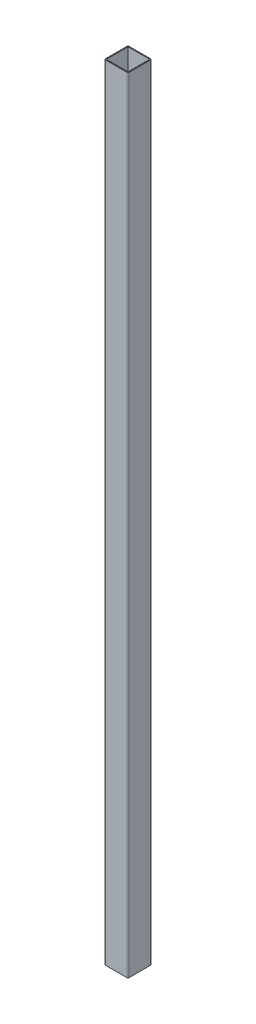
ISO-10303-21;
HEADER;
FILE_DESCRIPTION(('STEP AP214'),'2;1');
FILE_NAME('part.step','',(''),(''),'','','');
FILE_SCHEMA(('AUTOMOTIVE_DESIGN { 1 0 10303 214 1 1 1 1 }'));
ENDSEC;
DATA;
#1=APPLICATION_CONTEXT('core data for automotive mechanical design processes');
#2=APPLICATION_PROTOCOL_DEFINITION('international standard','automotive_design',2000,#1);
#3=PRODUCT_CONTEXT('',#1,'mechanical');
#4=PRODUCT('Part','Part','',(#3));
#5=PRODUCT_RELATED_PRODUCT_CATEGORY('part','',(#4));
#6=PRODUCT_DEFINITION_FORMATION('','',#4);
#7=PRODUCT_DEFINITION_CONTEXT('part definition',#1,'design');
#8=PRODUCT_DEFINITION('design','',#6,#7);
#9=PRODUCT_DEFINITION_SHAPE('','',#8);
#10=(LENGTH_UNIT() NAMED_UNIT(*) SI_UNIT(.MILLI.,.METRE.));
#11=(NAMED_UNIT(*) PLANE_ANGLE_UNIT() SI_UNIT($,.RADIAN.));
#12=(NAMED_UNIT(*) SI_UNIT($,.STERADIAN.) SOLID_ANGLE_UNIT());
#13=UNCERTAINTY_MEASURE_WITH_UNIT(LENGTH_MEASURE(1.E-05),#10,'distance_accuracy_value','');
#14=(GEOMETRIC_REPRESENTATION_CONTEXT(3) GLOBAL_UNCERTAINTY_ASSIGNED_CONTEXT((#13)) GLOBAL_UNIT_ASSIGNED_CONTEXT((#10,
#11,#12)) REPRESENTATION_CONTEXT('',''));
#15=CARTESIAN_POINT('',(0.,0.,0.));
#16=DIRECTION('',(0.,0.,1.));
#17=DIRECTION('',(1.,0.,0.));
#18=AXIS2_PLACEMENT_3D('',#15,#16,#17);
#19=CARTESIAN_POINT('',(73.9990000000007,-5328.,73.999));
#20=DIRECTION('',(0.,1.,0.));
#21=DIRECTION('',(-1.,0.,0.));
#22=AXIS2_PLACEMENT_3D('',#19,#20,#21);
#23=CYLINDRICAL_SURFACE('',#22,6.00100000000001);
#24=CARTESIAN_POINT('',(73.999,0.,73.999));
#25=DIRECTION('',(0.,-1.,0.));
#26=DIRECTION('',(1.,0.,0.));
#27=AXIS2_PLACEMENT_3D('',#24,#25,#26);
#28=CIRCLE('',#27,6.00100000000001);
#29=CARTESIAN_POINT('',(80.,0.,73.999));
#30=VERTEX_POINT('',#29);
#31=CARTESIAN_POINT('',(73.999,0.,80.));
#32=VERTEX_POINT('',#31);
#33=EDGE_CURVE('E236',#30,#32,#28,.T.);
#34=ORIENTED_EDGE('',*,*,#33,.T.);
#35=DIRECTION('',(0.,1.,0.));
#36=VECTOR('',#35,1.);
#37=CARTESIAN_POINT('',(73.9990000000007,-5328.,80.));
#38=LINE('',#37,#36);
#39=CARTESIAN_POINT('',(73.9990000000007,-5328.,80.));
#40=VERTEX_POINT('',#39);
#41=EDGE_CURVE('E12',#40,#32,#38,.T.);
#42=ORIENTED_EDGE('',*,*,#41,.F.);
#43=CARTESIAN_POINT('',(73.9990000000007,-5328.,73.999));
#44=DIRECTION('',(0.,-1.,0.));
#45=DIRECTION('',(1.,0.,0.));
#46=AXIS2_PLACEMENT_3D('',#43,#44,#45);
#47=CIRCLE('',#46,6.00100000000001);
#48=CARTESIAN_POINT('',(80.0000000000006,-5328.,73.999));
#49=VERTEX_POINT('',#48);
#50=EDGE_CURVE('E314',#49,#40,#47,.T.);
#51=ORIENTED_EDGE('',*,*,#50,.F.);
#52=DIRECTION('',(0.,1.,0.));
#53=VECTOR('',#52,1.);
#54=CARTESIAN_POINT('',(80.0000000000006,-5328.,73.999));
#55=LINE('',#54,#53);
#56=EDGE_CURVE('E251',#49,#30,#55,.T.);
#57=ORIENTED_EDGE('',*,*,#56,.T.);
#58=EDGE_LOOP('',(#34,#42,#51,#57));
#59=FACE_BOUND('',#58,.T.);
#60=ADVANCED_FACE('F64',(#59),#23,.T.);
#61=CARTESIAN_POINT('',(73.9990000000007,-5328.,80.));
#62=DIRECTION('',(0.,0.,-1.));
#63=DIRECTION('',(-1.,0.,0.));
#64=AXIS2_PLACEMENT_3D('',#61,#62,#63);
#65=PLANE('',#64);
#66=DIRECTION('',(-1.,0.,0.));
#67=VECTOR('',#66,1.);
#68=CARTESIAN_POINT('',(73.999,0.,80.));
#69=LINE('',#68,#67);
#70=CARTESIAN_POINT('',(-73.999,0.,80.));
#71=VERTEX_POINT('',#70);
#72=EDGE_CURVE('E239',#32,#71,#69,.T.);
#73=ORIENTED_EDGE('',*,*,#72,.T.);
#74=DIRECTION('',(0.,1.,0.));
#75=VECTOR('',#74,1.);
#76=CARTESIAN_POINT('',(-73.9989999999994,-5328.,80.));
#77=LINE('',#76,#75);
#78=CARTESIAN_POINT('',(-73.9989999999994,-5328.,80.));
#79=VERTEX_POINT('',#78);
#80=EDGE_CURVE('E74',#79,#71,#77,.T.);
#81=ORIENTED_EDGE('',*,*,#80,.F.);
#82=DIRECTION('',(-1.,0.,0.));
#83=VECTOR('',#82,1.);
#84=CARTESIAN_POINT('',(73.9990000000007,-5328.,80.));
#85=LINE('',#84,#83);
#86=EDGE_CURVE('E316',#40,#79,#85,.T.);
#87=ORIENTED_EDGE('',*,*,#86,.F.);
#88=ORIENTED_EDGE('',*,*,#41,.T.);
#89=EDGE_LOOP('',(#73,#81,#87,#88));
#90=FACE_BOUND('',#89,.T.);
#91=ADVANCED_FACE('F351',(#90),#65,.F.);
#92=CARTESIAN_POINT('',(-73.9989999999994,-5328.,73.999));
#93=DIRECTION('',(0.,1.,0.));
#94=DIRECTION('',(-1.,0.,0.));
#95=AXIS2_PLACEMENT_3D('',#92,#93,#94);
#96=CYLINDRICAL_SURFACE('',#95,6.00100000000001);
#97=CARTESIAN_POINT('',(-73.999,0.,73.999));
#98=DIRECTION('',(0.,-1.,0.));
#99=DIRECTION('',(1.,0.,0.));
#100=AXIS2_PLACEMENT_3D('',#97,#98,#99);
#101=CIRCLE('',#100,6.00100000000001);
#102=CARTESIAN_POINT('',(-80.,0.,73.999));
#103=VERTEX_POINT('',#102);
#104=EDGE_CURVE('E241',#71,#103,#101,.T.);
#105=ORIENTED_EDGE('',*,*,#104,.T.);
#106=DIRECTION('',(0.,1.,0.));
#107=VECTOR('',#106,1.);
#108=CARTESIAN_POINT('',(-79.9999999999993,-5328.,73.999));
#109=LINE('',#108,#107);
#110=CARTESIAN_POINT('',(-79.9999999999993,-5328.,73.999));
#111=VERTEX_POINT('',#110);
#112=EDGE_CURVE('E258',#111,#103,#109,.T.);
#113=ORIENTED_EDGE('',*,*,#112,.F.);
#114=CARTESIAN_POINT('',(-73.9989999999994,-5328.,73.999));
#115=DIRECTION('',(0.,-1.,0.));
#116=DIRECTION('',(1.,0.,0.));
#117=AXIS2_PLACEMENT_3D('',#114,#115,#116);
#118=CIRCLE('',#117,6.00100000000001);
#119=EDGE_CURVE('E318',#79,#111,#118,.T.);
#120=ORIENTED_EDGE('',*,*,#119,.F.);
#121=ORIENTED_EDGE('',*,*,#80,.T.);
#122=EDGE_LOOP('',(#105,#113,#120,#121));
#123=FACE_BOUND('',#122,.T.);
#124=ADVANCED_FACE('F356',(#123),#96,.T.);
#125=CARTESIAN_POINT('',(-79.9999999999993,-5328.,-73.999));
#126=DIRECTION('',(1.,0.,0.));
#127=DIRECTION('',(0.,1.,0.));
#128=AXIS2_PLACEMENT_3D('',#125,#126,#127);
#129=PLANE('',#128);
#130=DIRECTION('',(0.,0.,-1.));
#131=VECTOR('',#130,1.);
#132=CARTESIAN_POINT('',(-80.,0.,-73.999));
#133=LINE('',#132,#131);
#134=CARTESIAN_POINT('',(-80.,0.,-73.999));
#135=VERTEX_POINT('',#134);
#136=EDGE_CURVE('E243',#103,#135,#133,.T.);
#137=ORIENTED_EDGE('',*,*,#136,.T.);
#138=DIRECTION('',(0.,1.,0.));
#139=VECTOR('',#138,1.);
#140=CARTESIAN_POINT('',(-79.9999999999993,-5328.,-73.999));
#141=LINE('',#140,#139);
#142=CARTESIAN_POINT('',(-79.9999999999993,-5328.,-73.999));
#143=VERTEX_POINT('',#142);
#144=EDGE_CURVE('E255',#143,#135,#141,.T.);
#145=ORIENTED_EDGE('',*,*,#144,.F.);
#146=DIRECTION('',(0.,0.,-1.));
#147=VECTOR('',#146,1.);
#148=CARTESIAN_POINT('',(-79.9999999999993,-5328.,-73.999));
#149=LINE('',#148,#147);
#150=EDGE_CURVE('E320',#111,#143,#149,.T.);
#151=ORIENTED_EDGE('',*,*,#150,.F.);
#152=ORIENTED_EDGE('',*,*,#112,.T.);
#153=EDGE_LOOP('',(#137,#145,#151,#152));
#154=FACE_BOUND('',#153,.T.);
#155=ADVANCED_FACE('F326',(#154),#129,.F.);
#156=CARTESIAN_POINT('',(-73.9989999999993,-5328.,-73.999));
#157=DIRECTION('',(0.,1.,0.));
#158=DIRECTION('',(-1.,0.,0.));
#159=AXIS2_PLACEMENT_3D('',#156,#157,#158);
#160=CYLINDRICAL_SURFACE('',#159,6.001);
#161=CARTESIAN_POINT('',(-73.999,0.,-73.999));
#162=DIRECTION('',(0.,-1.,0.));
#163=DIRECTION('',(1.,0.,0.));
#164=AXIS2_PLACEMENT_3D('',#161,#162,#163);
#165=CIRCLE('',#164,6.001);
#166=CARTESIAN_POINT('',(-73.999,0.,-80.));
#167=VERTEX_POINT('',#166);
#168=EDGE_CURVE('E245',#135,#167,#165,.T.);
#169=ORIENTED_EDGE('',*,*,#168,.T.);
#170=DIRECTION('',(0.,1.,0.));
#171=VECTOR('',#170,1.);
#172=CARTESIAN_POINT('',(-73.9989999999994,-5328.,-80.));
#173=LINE('',#172,#171);
#174=CARTESIAN_POINT('',(-73.9989999999994,-5328.,-80.));
#175=VERTEX_POINT('',#174);
#176=EDGE_CURVE('E203',#175,#167,#173,.T.);
#177=ORIENTED_EDGE('',*,*,#176,.F.);
#178=CARTESIAN_POINT('',(-73.9989999999993,-5328.,-73.999));
#179=DIRECTION('',(0.,-1.,0.));
#180=DIRECTION('',(1.,0.,0.));
#181=AXIS2_PLACEMENT_3D('',#178,#179,#180);
#182=CIRCLE('',#181,6.001);
#183=EDGE_CURVE('E194',#143,#175,#182,.T.);
#184=ORIENTED_EDGE('',*,*,#183,.F.);
#185=ORIENTED_EDGE('',*,*,#144,.T.);
#186=EDGE_LOOP('',(#169,#177,#184,#185));
#187=FACE_BOUND('',#186,.T.);
#188=ADVANCED_FACE('F330',(#187),#160,.T.);
#189=CARTESIAN_POINT('',(-73.9989999999994,-5328.,-80.));
#190=DIRECTION('',(0.,0.,1.));
#191=DIRECTION('',(1.,0.,0.));
#192=AXIS2_PLACEMENT_3D('',#189,#190,#191);
#193=PLANE('',#192);
#194=DIRECTION('',(1.,0.,0.));
#195=VECTOR('',#194,1.);
#196=CARTESIAN_POINT('',(-73.999,0.,-80.));
#197=LINE('',#196,#195);
#198=CARTESIAN_POINT('',(73.999,0.,-80.));
#199=VERTEX_POINT('',#198);
#200=EDGE_CURVE('E202',#167,#199,#197,.T.);
#201=ORIENTED_EDGE('',*,*,#200,.T.);
#202=DIRECTION('',(0.,1.,0.));
#203=VECTOR('',#202,1.);
#204=CARTESIAN_POINT('',(73.9990000000007,-5328.,-80.));
#205=LINE('',#204,#203);
#206=CARTESIAN_POINT('',(73.9990000000007,-5328.,-80.));
#207=VERTEX_POINT('',#206);
#208=EDGE_CURVE('E199',#207,#199,#205,.T.);
#209=ORIENTED_EDGE('',*,*,#208,.F.);
#210=DIRECTION('',(1.,0.,0.));
#211=VECTOR('',#210,1.);
#212=CARTESIAN_POINT('',(-73.9989999999994,-5328.,-80.));
#213=LINE('',#212,#211);
#214=EDGE_CURVE('E188',#175,#207,#213,.T.);
#215=ORIENTED_EDGE('',*,*,#214,.F.);
#216=ORIENTED_EDGE('',*,*,#176,.T.);
#217=EDGE_LOOP('',(#201,#209,#215,#216));
#218=FACE_BOUND('',#217,.T.);
#219=ADVANCED_FACE('F200',(#218),#193,.F.);
#220=CARTESIAN_POINT('',(73.9990000000006,-5328.,-73.999));
#221=DIRECTION('',(0.,1.,0.));
#222=DIRECTION('',(-1.,0.,0.));
#223=AXIS2_PLACEMENT_3D('',#220,#221,#222);
#224=CYLINDRICAL_SURFACE('',#223,6.001);
#225=CARTESIAN_POINT('',(73.999,0.,-73.999));
#226=DIRECTION('',(0.,-1.,0.));
#227=DIRECTION('',(1.,0.,0.));
#228=AXIS2_PLACEMENT_3D('',#225,#226,#227);
#229=CIRCLE('',#228,6.001);
#230=CARTESIAN_POINT('',(80.,0.,-73.999));
#231=VERTEX_POINT('',#230);
#232=EDGE_CURVE('E136',#199,#231,#229,.T.);
#233=ORIENTED_EDGE('',*,*,#232,.T.);
#234=DIRECTION('',(0.,1.,0.));
#235=VECTOR('',#234,1.);
#236=CARTESIAN_POINT('',(80.0000000000006,-5328.,-73.999));
#237=LINE('',#236,#235);
#238=CARTESIAN_POINT('',(80.0000000000006,-5328.,-73.999));
#239=VERTEX_POINT('',#238);
#240=EDGE_CURVE('E204',#239,#231,#237,.T.);
#241=ORIENTED_EDGE('',*,*,#240,.F.);
#242=CARTESIAN_POINT('',(73.9990000000006,-5328.,-73.999));
#243=DIRECTION('',(0.,-1.,0.));
#244=DIRECTION('',(1.,0.,0.));
#245=AXIS2_PLACEMENT_3D('',#242,#243,#244);
#246=CIRCLE('',#245,6.001);
#247=EDGE_CURVE('E192',#207,#239,#246,.T.);
#248=ORIENTED_EDGE('',*,*,#247,.F.);
#249=ORIENTED_EDGE('',*,*,#208,.T.);
#250=EDGE_LOOP('',(#233,#241,#248,#249));
#251=FACE_BOUND('',#250,.T.);
#252=ADVANCED_FACE('F206',(#251),#224,.T.);
#253=CARTESIAN_POINT('',(-73.9989999999994,-5328.,73.999));
#254=DIRECTION('',(0.,1.,0.));
#255=DIRECTION('',(-1.,0.,0.));
#256=AXIS2_PLACEMENT_3D('',#253,#254,#255);
#257=CYLINDRICAL_SURFACE('',#256,0.000999999999987122);
#258=CARTESIAN_POINT('',(-73.999,0.,73.999));
#259=DIRECTION('',(0.,-1.,0.));
#260=DIRECTION('',(1.,0.,0.));
#261=AXIS2_PLACEMENT_3D('',#258,#259,#260);
#262=CIRCLE('',#261,0.000999999999987122);
#263=CARTESIAN_POINT('',(-73.999,0.,74.));
#264=VERTEX_POINT('',#263);
#265=CARTESIAN_POINT('',(-74.,0.,73.999));
#266=VERTEX_POINT('',#265);
#267=EDGE_CURVE('E212',#264,#266,#262,.T.);
#268=ORIENTED_EDGE('',*,*,#267,.F.);
#269=DIRECTION('',(0.,1.,0.));
#270=VECTOR('',#269,1.);
#271=CARTESIAN_POINT('',(-73.9989999999993,-5328.,74.));
#272=LINE('',#271,#270);
#273=CARTESIAN_POINT('',(-73.9989999999993,-5328.,74.));
#274=VERTEX_POINT('',#273);
#275=EDGE_CURVE('E68',#274,#264,#272,.T.);
#276=ORIENTED_EDGE('',*,*,#275,.F.);
#277=CARTESIAN_POINT('',(-73.9989999999994,-5328.,73.999));
#278=DIRECTION('',(0.,-1.,0.));
#279=DIRECTION('',(1.,0.,0.));
#280=AXIS2_PLACEMENT_3D('',#277,#278,#279);
#281=CIRCLE('',#280,0.000999999999987122);
#282=CARTESIAN_POINT('',(-73.9999999999993,-5328.,73.999));
#283=VERTEX_POINT('',#282);
#284=EDGE_CURVE('E250',#274,#283,#281,.T.);
#285=ORIENTED_EDGE('',*,*,#284,.T.);
#286=DIRECTION('',(0.,1.,0.));
#287=VECTOR('',#286,1.);
#288=CARTESIAN_POINT('',(-73.9999999999993,-5328.,73.999));
#289=LINE('',#288,#287);
#290=EDGE_CURVE('E208',#283,#266,#289,.T.);
#291=ORIENTED_EDGE('',*,*,#290,.T.);
#292=EDGE_LOOP('',(#268,#276,#285,#291));
#293=FACE_BOUND('',#292,.T.);
#294=ADVANCED_FACE('F66',(#293),#257,.F.);
#295=CARTESIAN_POINT('',(73.9990000000006,-5328.,74.));
#296=DIRECTION('',(0.,0.,-1.));
#297=DIRECTION('',(-1.,0.,0.));
#298=AXIS2_PLACEMENT_3D('',#295,#296,#297);
#299=PLANE('',#298);
#300=DIRECTION('',(-1.,0.,0.));
#301=VECTOR('',#300,1.);
#302=CARTESIAN_POINT('',(73.999,0.,74.));
#303=LINE('',#302,#301);
#304=CARTESIAN_POINT('',(73.999,0.,74.));
#305=VERTEX_POINT('',#304);
#306=EDGE_CURVE('E215',#305,#264,#303,.T.);
#307=ORIENTED_EDGE('',*,*,#306,.F.);
#308=DIRECTION('',(0.,1.,0.));
#309=VECTOR('',#308,1.);
#310=CARTESIAN_POINT('',(73.9990000000006,-5328.,74.));
#311=LINE('',#310,#309);
#312=CARTESIAN_POINT('',(73.9990000000006,-5328.,74.));
#313=VERTEX_POINT('',#312);
#314=EDGE_CURVE('E273',#313,#305,#311,.T.);
#315=ORIENTED_EDGE('',*,*,#314,.F.);
#316=DIRECTION('',(-1.,0.,0.));
#317=VECTOR('',#316,1.);
#318=CARTESIAN_POINT('',(73.9990000000006,-5328.,74.));
#319=LINE('',#318,#317);
#320=EDGE_CURVE('E282',#313,#274,#319,.T.);
#321=ORIENTED_EDGE('',*,*,#320,.T.);
#322=ORIENTED_EDGE('',*,*,#275,.T.);
#323=EDGE_LOOP('',(#307,#315,#321,#322));
#324=FACE_BOUND('',#323,.T.);
#325=ADVANCED_FACE('F280',(#324),#299,.T.);
#326=CARTESIAN_POINT('',(73.9990000000007,-5328.,73.999));
#327=DIRECTION('',(0.,1.,0.));
#328=DIRECTION('',(-1.,0.,0.));
#329=AXIS2_PLACEMENT_3D('',#326,#327,#328);
#330=CYLINDRICAL_SURFACE('',#329,0.000999999999987122);
#331=CARTESIAN_POINT('',(73.999,0.,73.999));
#332=DIRECTION('',(0.,-1.,0.));
#333=DIRECTION('',(1.,0.,0.));
#334=AXIS2_PLACEMENT_3D('',#331,#332,#333);
#335=CIRCLE('',#334,0.000999999999987122);
#336=CARTESIAN_POINT('',(74.,0.,73.999));
#337=VERTEX_POINT('',#336);
#338=EDGE_CURVE('E218',#337,#305,#335,.T.);
#339=ORIENTED_EDGE('',*,*,#338,.F.);
#340=DIRECTION('',(0.,1.,0.));
#341=VECTOR('',#340,1.);
#342=CARTESIAN_POINT('',(74.0000000000007,-5328.,73.999));
#343=LINE('',#342,#341);
#344=CARTESIAN_POINT('',(74.0000000000007,-5328.,73.999));
#345=VERTEX_POINT('',#344);
#346=EDGE_CURVE('E272',#345,#337,#343,.T.);
#347=ORIENTED_EDGE('',*,*,#346,.F.);
#348=CARTESIAN_POINT('',(73.9990000000007,-5328.,73.999));
#349=DIRECTION('',(0.,-1.,0.));
#350=DIRECTION('',(1.,0.,0.));
#351=AXIS2_PLACEMENT_3D('',#348,#349,#350);
#352=CIRCLE('',#351,0.000999999999987122);
#353=EDGE_CURVE('E290',#345,#313,#352,.T.);
#354=ORIENTED_EDGE('',*,*,#353,.T.);
#355=ORIENTED_EDGE('',*,*,#314,.T.);
#356=EDGE_LOOP('',(#339,#347,#354,#355));
#357=FACE_BOUND('',#356,.T.);
#358=ADVANCED_FACE('F288',(#357),#330,.F.);
#359=CARTESIAN_POINT('',(74.0000000000006,-5328.,73.999));
#360=DIRECTION('',(-1.,0.,0.));
#361=DIRECTION('',(0.,-1.,0.));
#362=AXIS2_PLACEMENT_3D('',#359,#360,#361);
#363=PLANE('',#362);
#364=DIRECTION('',(0.,0.,1.));
#365=VECTOR('',#364,1.);
#366=CARTESIAN_POINT('',(74.,0.,73.999));
#367=LINE('',#366,#365);
#368=CARTESIAN_POINT('',(74.,0.,-73.999));
#369=VERTEX_POINT('',#368);
#370=EDGE_CURVE('E221',#369,#337,#367,.T.);
#371=ORIENTED_EDGE('',*,*,#370,.F.);
#372=DIRECTION('',(0.,1.,0.));
#373=VECTOR('',#372,1.);
#374=CARTESIAN_POINT('',(74.0000000000006,-5328.,-73.999));
#375=LINE('',#374,#373);
#376=CARTESIAN_POINT('',(74.0000000000006,-5328.,-73.999));
#377=VERTEX_POINT('',#376);
#378=EDGE_CURVE('E270',#377,#369,#375,.T.);
#379=ORIENTED_EDGE('',*,*,#378,.F.);
#380=DIRECTION('',(0.,0.,1.));
#381=VECTOR('',#380,1.);
#382=CARTESIAN_POINT('',(74.0000000000006,-5328.,73.999));
#383=LINE('',#382,#381);
#384=EDGE_CURVE('E296',#377,#345,#383,.T.);
#385=ORIENTED_EDGE('',*,*,#384,.T.);
#386=ORIENTED_EDGE('',*,*,#346,.T.);
#387=EDGE_LOOP('',(#371,#379,#385,#386));
#388=FACE_BOUND('',#387,.T.);
#389=ADVANCED_FACE('F299',(#388),#363,.T.);
#390=CARTESIAN_POINT('',(73.9990000000006,-5328.,-73.999));
#391=DIRECTION('',(0.,1.,0.));
#392=DIRECTION('',(-1.,0.,0.));
#393=AXIS2_PLACEMENT_3D('',#390,#391,#392);
#394=CYLINDRICAL_SURFACE('',#393,0.000999999999980183);
#395=CARTESIAN_POINT('',(73.999,0.,-73.999));
#396=DIRECTION('',(0.,-1.,0.));
#397=DIRECTION('',(1.,0.,0.));
#398=AXIS2_PLACEMENT_3D('',#395,#396,#397);
#399=CIRCLE('',#398,0.000999999999980183);
#400=CARTESIAN_POINT('',(73.999,0.,-74.));
#401=VERTEX_POINT('',#400);
#402=EDGE_CURVE('E224',#401,#369,#399,.T.);
#403=ORIENTED_EDGE('',*,*,#402,.F.);
#404=DIRECTION('',(0.,1.,0.));
#405=VECTOR('',#404,1.);
#406=CARTESIAN_POINT('',(73.9990000000006,-5328.,-74.));
#407=LINE('',#406,#405);
#408=CARTESIAN_POINT('',(73.9990000000006,-5328.,-74.));
#409=VERTEX_POINT('',#408);
#410=EDGE_CURVE('E268',#409,#401,#407,.T.);
#411=ORIENTED_EDGE('',*,*,#410,.F.);
#412=CARTESIAN_POINT('',(73.9990000000006,-5328.,-73.999));
#413=DIRECTION('',(0.,-1.,0.));
#414=DIRECTION('',(1.,0.,0.));
#415=AXIS2_PLACEMENT_3D('',#412,#413,#414);
#416=CIRCLE('',#415,0.000999999999980183);
#417=EDGE_CURVE('E300',#409,#377,#416,.T.);
#418=ORIENTED_EDGE('',*,*,#417,.T.);
#419=ORIENTED_EDGE('',*,*,#378,.T.);
#420=EDGE_LOOP('',(#403,#411,#418,#419));
#421=FACE_BOUND('',#420,.T.);
#422=ADVANCED_FACE('F367',(#421),#394,.F.);
#423=CARTESIAN_POINT('',(-73.9989999999993,-5328.,-74.));
#424=DIRECTION('',(0.,0.,1.));
#425=DIRECTION('',(1.,0.,0.));
#426=AXIS2_PLACEMENT_3D('',#423,#424,#425);
#427=PLANE('',#426);
#428=DIRECTION('',(1.,0.,0.));
#429=VECTOR('',#428,1.);
#430=CARTESIAN_POINT('',(-73.999,0.,-74.));
#431=LINE('',#430,#429);
#432=CARTESIAN_POINT('',(-73.999,0.,-74.));
#433=VERTEX_POINT('',#432);
#434=EDGE_CURVE('E227',#433,#401,#431,.T.);
#435=ORIENTED_EDGE('',*,*,#434,.F.);
#436=DIRECTION('',(0.,1.,0.));
#437=VECTOR('',#436,1.);
#438=CARTESIAN_POINT('',(-73.9989999999993,-5328.,-74.));
#439=LINE('',#438,#437);
#440=CARTESIAN_POINT('',(-73.9989999999993,-5328.,-74.));
#441=VERTEX_POINT('',#440);
#442=EDGE_CURVE('E266',#441,#433,#439,.T.);
#443=ORIENTED_EDGE('',*,*,#442,.F.);
#444=DIRECTION('',(1.,0.,0.));
#445=VECTOR('',#444,1.);
#446=CARTESIAN_POINT('',(-73.9989999999993,-5328.,-74.));
#447=LINE('',#446,#445);
#448=EDGE_CURVE('E302',#441,#409,#447,.T.);
#449=ORIENTED_EDGE('',*,*,#448,.T.);
#450=ORIENTED_EDGE('',*,*,#410,.T.);
#451=EDGE_LOOP('',(#435,#443,#449,#450));
#452=FACE_BOUND('',#451,.T.);
#453=ADVANCED_FACE('F363',(#452),#427,.T.);
#454=CARTESIAN_POINT('',(-73.9989999999993,-5328.,-73.999));
#455=DIRECTION('',(0.,1.,0.));
#456=DIRECTION('',(-1.,0.,0.));
#457=AXIS2_PLACEMENT_3D('',#454,#455,#456);
#458=CYLINDRICAL_SURFACE('',#457,0.000999999999980183);
#459=CARTESIAN_POINT('',(-73.999,0.,-73.999));
#460=DIRECTION('',(0.,-1.,0.));
#461=DIRECTION('',(1.,0.,0.));
#462=AXIS2_PLACEMENT_3D('',#459,#460,#461);
#463=CIRCLE('',#462,0.000999999999980183);
#464=CARTESIAN_POINT('',(-74.,0.,-73.999));
#465=VERTEX_POINT('',#464);
#466=EDGE_CURVE('E230',#465,#433,#463,.T.);
#467=ORIENTED_EDGE('',*,*,#466,.F.);
#468=DIRECTION('',(0.,1.,0.));
#469=VECTOR('',#468,1.);
#470=CARTESIAN_POINT('',(-73.9999999999993,-5328.,-73.999));
#471=LINE('',#470,#469);
#472=CARTESIAN_POINT('',(-73.9999999999993,-5328.,-73.999));
#473=VERTEX_POINT('',#472);
#474=EDGE_CURVE('E264',#473,#465,#471,.T.);
#475=ORIENTED_EDGE('',*,*,#474,.F.);
#476=CARTESIAN_POINT('',(-73.9989999999993,-5328.,-73.999));
#477=DIRECTION('',(0.,-1.,0.));
#478=DIRECTION('',(1.,0.,0.));
#479=AXIS2_PLACEMENT_3D('',#476,#477,#478);
#480=CIRCLE('',#479,0.000999999999980183);
#481=EDGE_CURVE('E308',#473,#441,#480,.T.);
#482=ORIENTED_EDGE('',*,*,#481,.T.);
#483=ORIENTED_EDGE('',*,*,#442,.T.);
#484=EDGE_LOOP('',(#467,#475,#482,#483));
#485=FACE_BOUND('',#484,.T.);
#486=ADVANCED_FACE('F345',(#485),#458,.F.);
#487=CARTESIAN_POINT('',(-73.9999999999993,-5328.,-73.999));
#488=DIRECTION('',(1.,0.,0.));
#489=DIRECTION('',(0.,1.,0.));
#490=AXIS2_PLACEMENT_3D('',#487,#488,#489);
#491=PLANE('',#490);
#492=DIRECTION('',(0.,0.,-1.));
#493=VECTOR('',#492,1.);
#494=CARTESIAN_POINT('',(-74.,0.,-73.999));
#495=LINE('',#494,#493);
#496=EDGE_CURVE('E233',#266,#465,#495,.T.);
#497=ORIENTED_EDGE('',*,*,#496,.F.);
#498=ORIENTED_EDGE('',*,*,#290,.F.);
#499=DIRECTION('',(0.,0.,-1.));
#500=VECTOR('',#499,1.);
#501=CARTESIAN_POINT('',(-73.9999999999993,-5328.,-73.999));
#502=LINE('',#501,#500);
#503=EDGE_CURVE('E311',#283,#473,#502,.T.);
#504=ORIENTED_EDGE('',*,*,#503,.T.);
#505=ORIENTED_EDGE('',*,*,#474,.T.);
#506=EDGE_LOOP('',(#497,#498,#504,#505));
#507=FACE_BOUND('',#506,.T.);
#508=ADVANCED_FACE('F338',(#507),#491,.T.);
#509=CARTESIAN_POINT('',(80.0000000000006,-5328.,73.999));
#510=DIRECTION('',(-1.,0.,0.));
#511=DIRECTION('',(0.,-1.,0.));
#512=AXIS2_PLACEMENT_3D('',#509,#510,#511);
#513=PLANE('',#512);
#514=DIRECTION('',(0.,0.,1.));
#515=VECTOR('',#514,1.);
#516=CARTESIAN_POINT('',(80.,0.,73.999));
#517=LINE('',#516,#515);
#518=EDGE_CURVE('E142',#231,#30,#517,.T.);
#519=ORIENTED_EDGE('',*,*,#518,.T.);
#520=ORIENTED_EDGE('',*,*,#56,.F.);
#521=DIRECTION('',(0.,0.,1.));
#522=VECTOR('',#521,1.);
#523=CARTESIAN_POINT('',(80.0000000000006,-5328.,73.999));
#524=LINE('',#523,#522);
#525=EDGE_CURVE('E83',#239,#49,#524,.T.);
#526=ORIENTED_EDGE('',*,*,#525,.F.);
#527=ORIENTED_EDGE('',*,*,#240,.T.);
#528=EDGE_LOOP('',(#519,#520,#526,#527));
#529=FACE_BOUND('',#528,.T.);
#530=ADVANCED_FACE('F336',(#529),#513,.F.);
#531=CARTESIAN_POINT('',(73.9990000000007,-5328.,73.999));
#532=DIRECTION('',(0.,-1.,0.));
#533=DIRECTION('',(1.,0.,0.));
#534=AXIS2_PLACEMENT_3D('',#531,#532,#533);
#535=PLANE('',#534);
#536=ORIENTED_EDGE('',*,*,#284,.F.);
#537=ORIENTED_EDGE('',*,*,#320,.F.);
#538=ORIENTED_EDGE('',*,*,#353,.F.);
#539=ORIENTED_EDGE('',*,*,#384,.F.);
#540=ORIENTED_EDGE('',*,*,#417,.F.);
#541=ORIENTED_EDGE('',*,*,#448,.F.);
#542=ORIENTED_EDGE('',*,*,#481,.F.);
#543=ORIENTED_EDGE('',*,*,#503,.F.);
#544=EDGE_LOOP('',(#536,#537,#538,#539,#540,#541,#542,#543));
#545=FACE_BOUND('',#544,.T.);
#546=ORIENTED_EDGE('',*,*,#50,.T.);
#547=ORIENTED_EDGE('',*,*,#86,.T.);
#548=ORIENTED_EDGE('',*,*,#119,.T.);
#549=ORIENTED_EDGE('',*,*,#150,.T.);
#550=ORIENTED_EDGE('',*,*,#183,.T.);
#551=ORIENTED_EDGE('',*,*,#214,.T.);
#552=ORIENTED_EDGE('',*,*,#247,.T.);
#553=ORIENTED_EDGE('',*,*,#525,.T.);
#554=EDGE_LOOP('',(#546,#547,#548,#549,#550,#551,#552,#553));
#555=FACE_BOUND('',#554,.T.);
#556=ADVANCED_FACE('F190',(#545,#555),#535,.T.);
#557=CARTESIAN_POINT('',(73.999,0.,73.999));
#558=DIRECTION('',(0.,-1.,0.));
#559=DIRECTION('',(1.,0.,0.));
#560=AXIS2_PLACEMENT_3D('',#557,#558,#559);
#561=PLANE('',#560);
#562=ORIENTED_EDGE('',*,*,#267,.T.);
#563=ORIENTED_EDGE('',*,*,#496,.T.);
#564=ORIENTED_EDGE('',*,*,#466,.T.);
#565=ORIENTED_EDGE('',*,*,#434,.T.);
#566=ORIENTED_EDGE('',*,*,#402,.T.);
#567=ORIENTED_EDGE('',*,*,#370,.T.);
#568=ORIENTED_EDGE('',*,*,#338,.T.);
#569=ORIENTED_EDGE('',*,*,#306,.T.);
#570=EDGE_LOOP('',(#562,#563,#564,#565,#566,#567,#568,#569));
#571=FACE_BOUND('',#570,.T.);
#572=ORIENTED_EDGE('',*,*,#33,.F.);
#573=ORIENTED_EDGE('',*,*,#518,.F.);
#574=ORIENTED_EDGE('',*,*,#232,.F.);
#575=ORIENTED_EDGE('',*,*,#200,.F.);
#576=ORIENTED_EDGE('',*,*,#168,.F.);
#577=ORIENTED_EDGE('',*,*,#136,.F.);
#578=ORIENTED_EDGE('',*,*,#104,.F.);
#579=ORIENTED_EDGE('',*,*,#72,.F.);
#580=EDGE_LOOP('',(#572,#573,#574,#575,#576,#577,#578,#579));
#581=FACE_BOUND('',#580,.T.);
#582=ADVANCED_FACE('F285',(#571,#581),#561,.F.);
#583=CLOSED_SHELL('',(#60,#91,#124,#155,#188,#219,#252,#294,#325,#358,#389,#422,#453,#486,#508,
#530,#556,#582));
#584=MANIFOLD_SOLID_BREP('B2',#583);
#585=ADVANCED_BREP_SHAPE_REPRESENTATION('',(#18,#584),#14);
#586=SHAPE_DEFINITION_REPRESENTATION(#9,#585);
ENDSEC;
END-ISO-10303-21;
